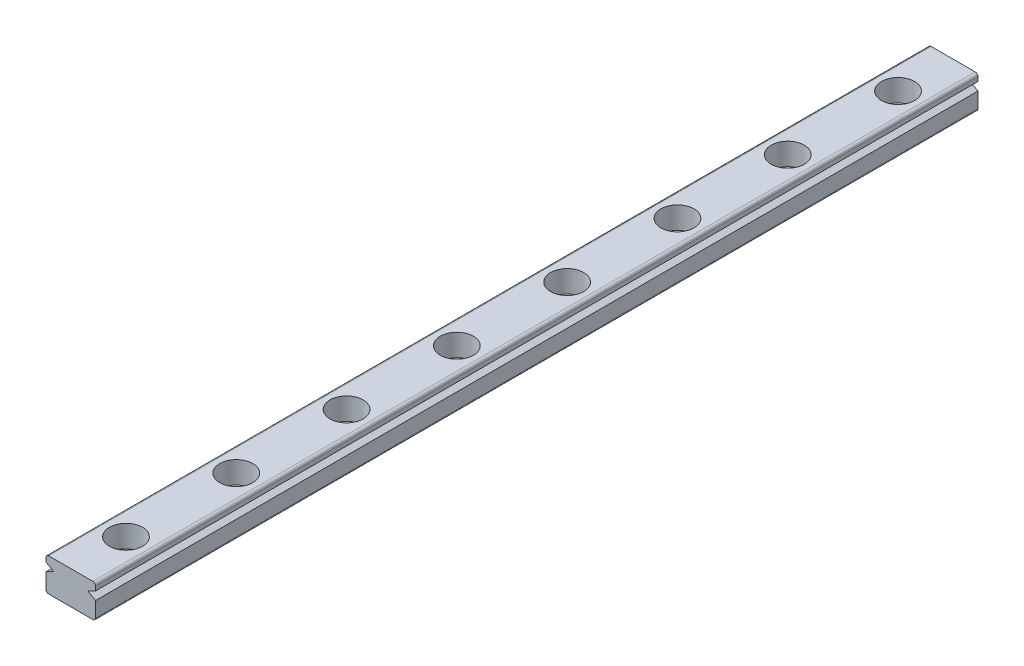
ISO-10303-21;
HEADER;
FILE_DESCRIPTION(('STEP AP214'),'2;1');
FILE_NAME('part.step','',(''),(''),'','','');
FILE_SCHEMA(('AUTOMOTIVE_DESIGN { 1 0 10303 214 1 1 1 1 }'));
ENDSEC;
DATA;
#1=APPLICATION_CONTEXT('core data for automotive mechanical design processes');
#2=APPLICATION_PROTOCOL_DEFINITION('international standard','automotive_design',2000,#1);
#3=PRODUCT_CONTEXT('',#1,'mechanical');
#4=PRODUCT('Part','Part','',(#3));
#5=PRODUCT_RELATED_PRODUCT_CATEGORY('part','',(#4));
#6=PRODUCT_DEFINITION_FORMATION('','',#4);
#7=PRODUCT_DEFINITION_CONTEXT('part definition',#1,'design');
#8=PRODUCT_DEFINITION('design','',#6,#7);
#9=PRODUCT_DEFINITION_SHAPE('','',#8);
#10=(LENGTH_UNIT() NAMED_UNIT(*) SI_UNIT(.MILLI.,.METRE.));
#11=(NAMED_UNIT(*) PLANE_ANGLE_UNIT() SI_UNIT($,.RADIAN.));
#12=(NAMED_UNIT(*) SI_UNIT($,.STERADIAN.) SOLID_ANGLE_UNIT());
#13=UNCERTAINTY_MEASURE_WITH_UNIT(LENGTH_MEASURE(1.E-05),#10,'distance_accuracy_value','');
#14=(GEOMETRIC_REPRESENTATION_CONTEXT(3) GLOBAL_UNCERTAINTY_ASSIGNED_CONTEXT((#13)) GLOBAL_UNIT_ASSIGNED_CONTEXT((#10,
#11,#12)) REPRESENTATION_CONTEXT('',''));
#15=CARTESIAN_POINT('',(0.,0.,0.));
#16=DIRECTION('',(0.,0.,1.));
#17=DIRECTION('',(1.,0.,0.));
#18=AXIS2_PLACEMENT_3D('',#15,#16,#17);
#19=CARTESIAN_POINT('',(0.,0.,150.));
#20=DIRECTION('',(0.,1.,0.));
#21=DIRECTION('',(-1.,0.,0.));
#22=AXIS2_PLACEMENT_3D('',#19,#20,#21);
#23=CYLINDRICAL_SURFACE('',#22,1.75);
#24=CARTESIAN_POINT('',(0.,0.,150.));
#25=DIRECTION('',(0.,1.,0.));
#26=DIRECTION('',(-1.,0.,0.));
#27=AXIS2_PLACEMENT_3D('',#24,#25,#26);
#28=CIRCLE('',#27,1.75);
#29=CARTESIAN_POINT('',(-1.75,0.,150.));
#30=VERTEX_POINT('',#29);
#31=EDGE_CURVE('E304',#30,#30,#28,.T.);
#32=ORIENTED_EDGE('',*,*,#31,.F.);
#33=EDGE_LOOP('',(#32));
#34=FACE_BOUND('',#33,.T.);
#35=CARTESIAN_POINT('',(0.,2.,150.));
#36=DIRECTION('',(0.,1.,0.));
#37=DIRECTION('',(-1.,0.,0.));
#38=AXIS2_PLACEMENT_3D('',#35,#36,#37);
#39=CIRCLE('',#38,1.75);
#40=CARTESIAN_POINT('',(-1.75,2.,150.));
#41=VERTEX_POINT('',#40);
#42=EDGE_CURVE('E11',#41,#41,#39,.T.);
#43=ORIENTED_EDGE('',*,*,#42,.T.);
#44=EDGE_LOOP('',(#43));
#45=FACE_BOUND('',#44,.T.);
#46=ADVANCED_FACE('F33',(#34,#45),#23,.F.);
#47=CARTESIAN_POINT('',(0.,2.,150.));
#48=DIRECTION('',(0.,1.,0.));
#49=DIRECTION('',(-1.,0.,0.));
#50=AXIS2_PLACEMENT_3D('',#47,#48,#49);
#51=PLANE('',#50);
#52=ORIENTED_EDGE('',*,*,#42,.F.);
#53=EDGE_LOOP('',(#52));
#54=FACE_BOUND('',#53,.T.);
#55=CARTESIAN_POINT('',(0.,2.,150.));
#56=DIRECTION('',(0.,1.,0.));
#57=DIRECTION('',(-1.,0.,0.));
#58=AXIS2_PLACEMENT_3D('',#55,#56,#57);
#59=CIRCLE('',#58,3.);
#60=CARTESIAN_POINT('',(-3.,2.,150.));
#61=VERTEX_POINT('',#60);
#62=EDGE_CURVE('E40',#61,#61,#59,.T.);
#63=ORIENTED_EDGE('',*,*,#62,.T.);
#64=EDGE_LOOP('',(#63));
#65=FACE_BOUND('',#64,.T.);
#66=ADVANCED_FACE('F312',(#54,#65),#51,.T.);
#67=CARTESIAN_POINT('',(0.,2.,150.));
#68=DIRECTION('',(0.,1.,0.));
#69=DIRECTION('',(-1.,0.,0.));
#70=AXIS2_PLACEMENT_3D('',#67,#68,#69);
#71=CYLINDRICAL_SURFACE('',#70,3.);
#72=ORIENTED_EDGE('',*,*,#62,.F.);
#73=EDGE_LOOP('',(#72));
#74=FACE_BOUND('',#73,.T.);
#75=CARTESIAN_POINT('',(0.,6.,150.));
#76=DIRECTION('',(0.,1.,0.));
#77=DIRECTION('',(-1.,0.,0.));
#78=AXIS2_PLACEMENT_3D('',#75,#76,#77);
#79=CIRCLE('',#78,3.);
#80=CARTESIAN_POINT('',(-3.,6.,150.));
#81=VERTEX_POINT('',#80);
#82=EDGE_CURVE('E307',#81,#81,#79,.T.);
#83=ORIENTED_EDGE('',*,*,#82,.T.);
#84=EDGE_LOOP('',(#83));
#85=FACE_BOUND('',#84,.T.);
#86=ADVANCED_FACE('F314',(#74,#85),#71,.F.);
#87=CARTESIAN_POINT('',(0.,0.,130.));
#88=DIRECTION('',(0.,1.,0.));
#89=DIRECTION('',(-1.,0.,0.));
#90=AXIS2_PLACEMENT_3D('',#87,#88,#89);
#91=CYLINDRICAL_SURFACE('',#90,1.75);
#92=CARTESIAN_POINT('',(0.,0.,130.));
#93=DIRECTION('',(0.,1.,0.));
#94=DIRECTION('',(-1.,0.,0.));
#95=AXIS2_PLACEMENT_3D('',#92,#93,#94);
#96=CIRCLE('',#95,1.75);
#97=CARTESIAN_POINT('',(-1.75,0.,130.));
#98=VERTEX_POINT('',#97);
#99=EDGE_CURVE('E292',#98,#98,#96,.T.);
#100=ORIENTED_EDGE('',*,*,#99,.F.);
#101=EDGE_LOOP('',(#100));
#102=FACE_BOUND('',#101,.T.);
#103=CARTESIAN_POINT('',(0.,2.,130.));
#104=DIRECTION('',(0.,1.,0.));
#105=DIRECTION('',(-1.,0.,0.));
#106=AXIS2_PLACEMENT_3D('',#103,#104,#105);
#107=CIRCLE('',#106,1.75);
#108=CARTESIAN_POINT('',(-1.75,2.,130.));
#109=VERTEX_POINT('',#108);
#110=EDGE_CURVE('E301',#109,#109,#107,.T.);
#111=ORIENTED_EDGE('',*,*,#110,.T.);
#112=EDGE_LOOP('',(#111));
#113=FACE_BOUND('',#112,.T.);
#114=ADVANCED_FACE('F317',(#102,#113),#91,.F.);
#115=CARTESIAN_POINT('',(0.,2.,130.));
#116=DIRECTION('',(0.,1.,0.));
#117=DIRECTION('',(-1.,0.,0.));
#118=AXIS2_PLACEMENT_3D('',#115,#116,#117);
#119=PLANE('',#118);
#120=ORIENTED_EDGE('',*,*,#110,.F.);
#121=EDGE_LOOP('',(#120));
#122=FACE_BOUND('',#121,.T.);
#123=CARTESIAN_POINT('',(0.,2.,130.));
#124=DIRECTION('',(0.,1.,0.));
#125=DIRECTION('',(-1.,0.,0.));
#126=AXIS2_PLACEMENT_3D('',#123,#124,#125);
#127=CIRCLE('',#126,3.);
#128=CARTESIAN_POINT('',(-3.,2.,130.));
#129=VERTEX_POINT('',#128);
#130=EDGE_CURVE('E298',#129,#129,#127,.T.);
#131=ORIENTED_EDGE('',*,*,#130,.T.);
#132=EDGE_LOOP('',(#131));
#133=FACE_BOUND('',#132,.T.);
#134=ADVANCED_FACE('F434',(#122,#133),#119,.T.);
#135=CARTESIAN_POINT('',(0.,2.,130.));
#136=DIRECTION('',(0.,1.,0.));
#137=DIRECTION('',(-1.,0.,0.));
#138=AXIS2_PLACEMENT_3D('',#135,#136,#137);
#139=CYLINDRICAL_SURFACE('',#138,3.);
#140=ORIENTED_EDGE('',*,*,#130,.F.);
#141=EDGE_LOOP('',(#140));
#142=FACE_BOUND('',#141,.T.);
#143=CARTESIAN_POINT('',(0.,6.,130.));
#144=DIRECTION('',(0.,1.,0.));
#145=DIRECTION('',(-1.,0.,0.));
#146=AXIS2_PLACEMENT_3D('',#143,#144,#145);
#147=CIRCLE('',#146,3.);
#148=CARTESIAN_POINT('',(-3.,6.,130.));
#149=VERTEX_POINT('',#148);
#150=EDGE_CURVE('E295',#149,#149,#147,.T.);
#151=ORIENTED_EDGE('',*,*,#150,.T.);
#152=EDGE_LOOP('',(#151));
#153=FACE_BOUND('',#152,.T.);
#154=ADVANCED_FACE('F430',(#142,#153),#139,.F.);
#155=CARTESIAN_POINT('',(0.,0.,110.));
#156=DIRECTION('',(0.,1.,0.));
#157=DIRECTION('',(-1.,0.,0.));
#158=AXIS2_PLACEMENT_3D('',#155,#156,#157);
#159=CYLINDRICAL_SURFACE('',#158,1.75);
#160=CARTESIAN_POINT('',(0.,0.,110.));
#161=DIRECTION('',(0.,1.,0.));
#162=DIRECTION('',(-1.,0.,0.));
#163=AXIS2_PLACEMENT_3D('',#160,#161,#162);
#164=CIRCLE('',#163,1.75);
#165=CARTESIAN_POINT('',(-1.75,0.,110.));
#166=VERTEX_POINT('',#165);
#167=EDGE_CURVE('E280',#166,#166,#164,.T.);
#168=ORIENTED_EDGE('',*,*,#167,.F.);
#169=EDGE_LOOP('',(#168));
#170=FACE_BOUND('',#169,.T.);
#171=CARTESIAN_POINT('',(0.,2.,110.));
#172=DIRECTION('',(0.,1.,0.));
#173=DIRECTION('',(-1.,0.,0.));
#174=AXIS2_PLACEMENT_3D('',#171,#172,#173);
#175=CIRCLE('',#174,1.75);
#176=CARTESIAN_POINT('',(-1.75,2.,110.));
#177=VERTEX_POINT('',#176);
#178=EDGE_CURVE('E289',#177,#177,#175,.T.);
#179=ORIENTED_EDGE('',*,*,#178,.T.);
#180=EDGE_LOOP('',(#179));
#181=FACE_BOUND('',#180,.T.);
#182=ADVANCED_FACE('F426',(#170,#181),#159,.F.);
#183=CARTESIAN_POINT('',(0.,2.,110.));
#184=DIRECTION('',(0.,1.,0.));
#185=DIRECTION('',(-1.,0.,0.));
#186=AXIS2_PLACEMENT_3D('',#183,#184,#185);
#187=PLANE('',#186);
#188=ORIENTED_EDGE('',*,*,#178,.F.);
#189=EDGE_LOOP('',(#188));
#190=FACE_BOUND('',#189,.T.);
#191=CARTESIAN_POINT('',(0.,2.,110.));
#192=DIRECTION('',(0.,1.,0.));
#193=DIRECTION('',(-1.,0.,0.));
#194=AXIS2_PLACEMENT_3D('',#191,#192,#193);
#195=CIRCLE('',#194,3.);
#196=CARTESIAN_POINT('',(-3.,2.,110.));
#197=VERTEX_POINT('',#196);
#198=EDGE_CURVE('E286',#197,#197,#195,.T.);
#199=ORIENTED_EDGE('',*,*,#198,.T.);
#200=EDGE_LOOP('',(#199));
#201=FACE_BOUND('',#200,.T.);
#202=ADVANCED_FACE('F422',(#190,#201),#187,.T.);
#203=CARTESIAN_POINT('',(0.,2.,110.));
#204=DIRECTION('',(0.,1.,0.));
#205=DIRECTION('',(-1.,0.,0.));
#206=AXIS2_PLACEMENT_3D('',#203,#204,#205);
#207=CYLINDRICAL_SURFACE('',#206,3.);
#208=ORIENTED_EDGE('',*,*,#198,.F.);
#209=EDGE_LOOP('',(#208));
#210=FACE_BOUND('',#209,.T.);
#211=CARTESIAN_POINT('',(0.,6.,110.));
#212=DIRECTION('',(0.,1.,0.));
#213=DIRECTION('',(-1.,0.,0.));
#214=AXIS2_PLACEMENT_3D('',#211,#212,#213);
#215=CIRCLE('',#214,3.);
#216=CARTESIAN_POINT('',(-3.,6.,110.));
#217=VERTEX_POINT('',#216);
#218=EDGE_CURVE('E283',#217,#217,#215,.T.);
#219=ORIENTED_EDGE('',*,*,#218,.T.);
#220=EDGE_LOOP('',(#219));
#221=FACE_BOUND('',#220,.T.);
#222=ADVANCED_FACE('F418',(#210,#221),#207,.F.);
#223=CARTESIAN_POINT('',(0.,0.,90.));
#224=DIRECTION('',(0.,1.,0.));
#225=DIRECTION('',(-1.,0.,0.));
#226=AXIS2_PLACEMENT_3D('',#223,#224,#225);
#227=CYLINDRICAL_SURFACE('',#226,1.75);
#228=CARTESIAN_POINT('',(0.,0.,90.));
#229=DIRECTION('',(0.,1.,0.));
#230=DIRECTION('',(-1.,0.,0.));
#231=AXIS2_PLACEMENT_3D('',#228,#229,#230);
#232=CIRCLE('',#231,1.75);
#233=CARTESIAN_POINT('',(-1.75,0.,90.));
#234=VERTEX_POINT('',#233);
#235=EDGE_CURVE('E268',#234,#234,#232,.T.);
#236=ORIENTED_EDGE('',*,*,#235,.F.);
#237=EDGE_LOOP('',(#236));
#238=FACE_BOUND('',#237,.T.);
#239=CARTESIAN_POINT('',(0.,2.,90.));
#240=DIRECTION('',(0.,1.,0.));
#241=DIRECTION('',(-1.,0.,0.));
#242=AXIS2_PLACEMENT_3D('',#239,#240,#241);
#243=CIRCLE('',#242,1.75);
#244=CARTESIAN_POINT('',(-1.75,2.,90.));
#245=VERTEX_POINT('',#244);
#246=EDGE_CURVE('E277',#245,#245,#243,.T.);
#247=ORIENTED_EDGE('',*,*,#246,.T.);
#248=EDGE_LOOP('',(#247));
#249=FACE_BOUND('',#248,.T.);
#250=ADVANCED_FACE('F414',(#238,#249),#227,.F.);
#251=CARTESIAN_POINT('',(0.,2.,90.));
#252=DIRECTION('',(0.,1.,0.));
#253=DIRECTION('',(-1.,0.,0.));
#254=AXIS2_PLACEMENT_3D('',#251,#252,#253);
#255=PLANE('',#254);
#256=ORIENTED_EDGE('',*,*,#246,.F.);
#257=EDGE_LOOP('',(#256));
#258=FACE_BOUND('',#257,.T.);
#259=CARTESIAN_POINT('',(0.,2.,90.));
#260=DIRECTION('',(0.,1.,0.));
#261=DIRECTION('',(-1.,0.,0.));
#262=AXIS2_PLACEMENT_3D('',#259,#260,#261);
#263=CIRCLE('',#262,3.);
#264=CARTESIAN_POINT('',(-3.,2.,90.));
#265=VERTEX_POINT('',#264);
#266=EDGE_CURVE('E274',#265,#265,#263,.T.);
#267=ORIENTED_EDGE('',*,*,#266,.T.);
#268=EDGE_LOOP('',(#267));
#269=FACE_BOUND('',#268,.T.);
#270=ADVANCED_FACE('F410',(#258,#269),#255,.T.);
#271=CARTESIAN_POINT('',(0.,2.,90.));
#272=DIRECTION('',(0.,1.,0.));
#273=DIRECTION('',(-1.,0.,0.));
#274=AXIS2_PLACEMENT_3D('',#271,#272,#273);
#275=CYLINDRICAL_SURFACE('',#274,3.);
#276=ORIENTED_EDGE('',*,*,#266,.F.);
#277=EDGE_LOOP('',(#276));
#278=FACE_BOUND('',#277,.T.);
#279=CARTESIAN_POINT('',(0.,6.,90.));
#280=DIRECTION('',(0.,1.,0.));
#281=DIRECTION('',(-1.,0.,0.));
#282=AXIS2_PLACEMENT_3D('',#279,#280,#281);
#283=CIRCLE('',#282,3.);
#284=CARTESIAN_POINT('',(-3.,6.,90.));
#285=VERTEX_POINT('',#284);
#286=EDGE_CURVE('E271',#285,#285,#283,.T.);
#287=ORIENTED_EDGE('',*,*,#286,.T.);
#288=EDGE_LOOP('',(#287));
#289=FACE_BOUND('',#288,.T.);
#290=ADVANCED_FACE('F406',(#278,#289),#275,.F.);
#291=CARTESIAN_POINT('',(0.,0.,70.));
#292=DIRECTION('',(0.,1.,0.));
#293=DIRECTION('',(-1.,0.,0.));
#294=AXIS2_PLACEMENT_3D('',#291,#292,#293);
#295=CYLINDRICAL_SURFACE('',#294,1.75);
#296=CARTESIAN_POINT('',(0.,0.,70.));
#297=DIRECTION('',(0.,1.,0.));
#298=DIRECTION('',(-1.,0.,0.));
#299=AXIS2_PLACEMENT_3D('',#296,#297,#298);
#300=CIRCLE('',#299,1.75);
#301=CARTESIAN_POINT('',(-1.75,0.,70.));
#302=VERTEX_POINT('',#301);
#303=EDGE_CURVE('E256',#302,#302,#300,.T.);
#304=ORIENTED_EDGE('',*,*,#303,.F.);
#305=EDGE_LOOP('',(#304));
#306=FACE_BOUND('',#305,.T.);
#307=CARTESIAN_POINT('',(0.,2.,70.));
#308=DIRECTION('',(0.,1.,0.));
#309=DIRECTION('',(-1.,0.,0.));
#310=AXIS2_PLACEMENT_3D('',#307,#308,#309);
#311=CIRCLE('',#310,1.75);
#312=CARTESIAN_POINT('',(-1.75,2.,70.));
#313=VERTEX_POINT('',#312);
#314=EDGE_CURVE('E265',#313,#313,#311,.T.);
#315=ORIENTED_EDGE('',*,*,#314,.T.);
#316=EDGE_LOOP('',(#315));
#317=FACE_BOUND('',#316,.T.);
#318=ADVANCED_FACE('F402',(#306,#317),#295,.F.);
#319=CARTESIAN_POINT('',(0.,2.,70.));
#320=DIRECTION('',(0.,1.,0.));
#321=DIRECTION('',(-1.,0.,0.));
#322=AXIS2_PLACEMENT_3D('',#319,#320,#321);
#323=PLANE('',#322);
#324=ORIENTED_EDGE('',*,*,#314,.F.);
#325=EDGE_LOOP('',(#324));
#326=FACE_BOUND('',#325,.T.);
#327=CARTESIAN_POINT('',(0.,2.,70.));
#328=DIRECTION('',(0.,1.,0.));
#329=DIRECTION('',(-1.,0.,0.));
#330=AXIS2_PLACEMENT_3D('',#327,#328,#329);
#331=CIRCLE('',#330,3.);
#332=CARTESIAN_POINT('',(-3.,2.,70.));
#333=VERTEX_POINT('',#332);
#334=EDGE_CURVE('E262',#333,#333,#331,.T.);
#335=ORIENTED_EDGE('',*,*,#334,.T.);
#336=EDGE_LOOP('',(#335));
#337=FACE_BOUND('',#336,.T.);
#338=ADVANCED_FACE('F398',(#326,#337),#323,.T.);
#339=CARTESIAN_POINT('',(0.,2.,70.));
#340=DIRECTION('',(0.,1.,0.));
#341=DIRECTION('',(-1.,0.,0.));
#342=AXIS2_PLACEMENT_3D('',#339,#340,#341);
#343=CYLINDRICAL_SURFACE('',#342,3.);
#344=ORIENTED_EDGE('',*,*,#334,.F.);
#345=EDGE_LOOP('',(#344));
#346=FACE_BOUND('',#345,.T.);
#347=CARTESIAN_POINT('',(0.,6.,70.));
#348=DIRECTION('',(0.,1.,0.));
#349=DIRECTION('',(-1.,0.,0.));
#350=AXIS2_PLACEMENT_3D('',#347,#348,#349);
#351=CIRCLE('',#350,3.);
#352=CARTESIAN_POINT('',(-3.,6.,70.));
#353=VERTEX_POINT('',#352);
#354=EDGE_CURVE('E259',#353,#353,#351,.T.);
#355=ORIENTED_EDGE('',*,*,#354,.T.);
#356=EDGE_LOOP('',(#355));
#357=FACE_BOUND('',#356,.T.);
#358=ADVANCED_FACE('F394',(#346,#357),#343,.F.);
#359=CARTESIAN_POINT('',(0.,0.,50.));
#360=DIRECTION('',(0.,1.,0.));
#361=DIRECTION('',(-1.,0.,0.));
#362=AXIS2_PLACEMENT_3D('',#359,#360,#361);
#363=CYLINDRICAL_SURFACE('',#362,1.75);
#364=CARTESIAN_POINT('',(0.,0.,50.));
#365=DIRECTION('',(0.,1.,0.));
#366=DIRECTION('',(-1.,0.,0.));
#367=AXIS2_PLACEMENT_3D('',#364,#365,#366);
#368=CIRCLE('',#367,1.75);
#369=CARTESIAN_POINT('',(-1.75,0.,50.));
#370=VERTEX_POINT('',#369);
#371=EDGE_CURVE('E244',#370,#370,#368,.T.);
#372=ORIENTED_EDGE('',*,*,#371,.F.);
#373=EDGE_LOOP('',(#372));
#374=FACE_BOUND('',#373,.T.);
#375=CARTESIAN_POINT('',(0.,2.,50.));
#376=DIRECTION('',(0.,1.,0.));
#377=DIRECTION('',(-1.,0.,0.));
#378=AXIS2_PLACEMENT_3D('',#375,#376,#377);
#379=CIRCLE('',#378,1.75);
#380=CARTESIAN_POINT('',(-1.75,2.,50.));
#381=VERTEX_POINT('',#380);
#382=EDGE_CURVE('E253',#381,#381,#379,.T.);
#383=ORIENTED_EDGE('',*,*,#382,.T.);
#384=EDGE_LOOP('',(#383));
#385=FACE_BOUND('',#384,.T.);
#386=ADVANCED_FACE('F390',(#374,#385),#363,.F.);
#387=CARTESIAN_POINT('',(0.,2.,50.));
#388=DIRECTION('',(0.,1.,0.));
#389=DIRECTION('',(-1.,0.,0.));
#390=AXIS2_PLACEMENT_3D('',#387,#388,#389);
#391=PLANE('',#390);
#392=ORIENTED_EDGE('',*,*,#382,.F.);
#393=EDGE_LOOP('',(#392));
#394=FACE_BOUND('',#393,.T.);
#395=CARTESIAN_POINT('',(0.,2.,50.));
#396=DIRECTION('',(0.,1.,0.));
#397=DIRECTION('',(-1.,0.,0.));
#398=AXIS2_PLACEMENT_3D('',#395,#396,#397);
#399=CIRCLE('',#398,3.);
#400=CARTESIAN_POINT('',(-3.,2.,50.));
#401=VERTEX_POINT('',#400);
#402=EDGE_CURVE('E250',#401,#401,#399,.T.);
#403=ORIENTED_EDGE('',*,*,#402,.T.);
#404=EDGE_LOOP('',(#403));
#405=FACE_BOUND('',#404,.T.);
#406=ADVANCED_FACE('F386',(#394,#405),#391,.T.);
#407=CARTESIAN_POINT('',(0.,2.,50.));
#408=DIRECTION('',(0.,1.,0.));
#409=DIRECTION('',(-1.,0.,0.));
#410=AXIS2_PLACEMENT_3D('',#407,#408,#409);
#411=CYLINDRICAL_SURFACE('',#410,3.);
#412=ORIENTED_EDGE('',*,*,#402,.F.);
#413=EDGE_LOOP('',(#412));
#414=FACE_BOUND('',#413,.T.);
#415=CARTESIAN_POINT('',(0.,6.,50.));
#416=DIRECTION('',(0.,1.,0.));
#417=DIRECTION('',(-1.,0.,0.));
#418=AXIS2_PLACEMENT_3D('',#415,#416,#417);
#419=CIRCLE('',#418,3.);
#420=CARTESIAN_POINT('',(-3.,6.,50.));
#421=VERTEX_POINT('',#420);
#422=EDGE_CURVE('E247',#421,#421,#419,.T.);
#423=ORIENTED_EDGE('',*,*,#422,.T.);
#424=EDGE_LOOP('',(#423));
#425=FACE_BOUND('',#424,.T.);
#426=ADVANCED_FACE('F359',(#414,#425),#411,.F.);
#427=CARTESIAN_POINT('',(-4.5,3.25,160.));
#428=DIRECTION('',(1.,0.,0.));
#429=DIRECTION('',(0.,0.,-1.));
#430=AXIS2_PLACEMENT_3D('',#427,#428,#429);
#431=PLANE('',#430);
#432=DIRECTION('',(0.,-1.,0.));
#433=VECTOR('',#432,1.);
#434=CARTESIAN_POINT('',(-4.5,3.25,0.));
#435=LINE('',#434,#433);
#436=CARTESIAN_POINT('',(-4.5,3.25,0.));
#437=VERTEX_POINT('',#436);
#438=CARTESIAN_POINT('',(-4.5,0.5,0.));
#439=VERTEX_POINT('',#438);
#440=EDGE_CURVE('E177',#437,#439,#435,.T.);
#441=ORIENTED_EDGE('',*,*,#440,.T.);
#442=DIRECTION('',(0.,0.,-1.));
#443=VECTOR('',#442,1.);
#444=CARTESIAN_POINT('',(-4.5,0.5,160.));
#445=LINE('',#444,#443);
#446=CARTESIAN_POINT('',(-4.5,0.5,160.));
#447=VERTEX_POINT('',#446);
#448=EDGE_CURVE('E233',#439,#447,#445,.F.);
#449=ORIENTED_EDGE('',*,*,#448,.T.);
#450=DIRECTION('',(0.,-1.,0.));
#451=VECTOR('',#450,1.);
#452=CARTESIAN_POINT('',(-4.5,3.25,160.));
#453=LINE('',#452,#451);
#454=CARTESIAN_POINT('',(-4.5,3.25,160.));
#455=VERTEX_POINT('',#454);
#456=EDGE_CURVE('E200',#455,#447,#453,.T.);
#457=ORIENTED_EDGE('',*,*,#456,.F.);
#458=DIRECTION('',(0.,0.,-1.));
#459=VECTOR('',#458,1.);
#460=CARTESIAN_POINT('',(-4.5,3.25,160.));
#461=LINE('',#460,#459);
#462=EDGE_CURVE('E176',#455,#437,#461,.T.);
#463=ORIENTED_EDGE('',*,*,#462,.T.);
#464=EDGE_LOOP('',(#441,#449,#457,#463));
#465=FACE_BOUND('',#464,.T.);
#466=ADVANCED_FACE('F351',(#465),#431,.F.);
#467=CARTESIAN_POINT('',(-4.5,0.,160.));
#468=DIRECTION('',(0.,1.,0.));
#469=DIRECTION('',(-1.,0.,0.));
#470=AXIS2_PLACEMENT_3D('',#467,#468,#469);
#471=PLANE('',#470);
#472=CARTESIAN_POINT('',(0.,0.,30.));
#473=DIRECTION('',(0.,1.,0.));
#474=DIRECTION('',(-1.,0.,0.));
#475=AXIS2_PLACEMENT_3D('',#472,#473,#474);
#476=CIRCLE('',#475,1.75);
#477=CARTESIAN_POINT('',(-1.75,0.,30.));
#478=VERTEX_POINT('',#477);
#479=EDGE_CURVE('E742',#478,#478,#476,.T.);
#480=ORIENTED_EDGE('',*,*,#479,.T.);
#481=EDGE_LOOP('',(#480));
#482=FACE_BOUND('',#481,.T.);
#483=CARTESIAN_POINT('',(0.,0.,10.));
#484=DIRECTION('',(0.,1.,0.));
#485=DIRECTION('',(-1.,0.,0.));
#486=AXIS2_PLACEMENT_3D('',#483,#484,#485);
#487=CIRCLE('',#486,1.75);
#488=CARTESIAN_POINT('',(-1.75,0.,10.));
#489=VERTEX_POINT('',#488);
#490=EDGE_CURVE('E725',#489,#489,#487,.T.);
#491=ORIENTED_EDGE('',*,*,#490,.T.);
#492=EDGE_LOOP('',(#491));
#493=FACE_BOUND('',#492,.T.);
#494=DIRECTION('',(1.,0.,0.));
#495=VECTOR('',#494,1.);
#496=CARTESIAN_POINT('',(-4.5,0.,0.));
#497=LINE('',#496,#495);
#498=CARTESIAN_POINT('',(-4.,0.,0.));
#499=VERTEX_POINT('',#498);
#500=CARTESIAN_POINT('',(4.,0.,0.));
#501=VERTEX_POINT('',#500);
#502=EDGE_CURVE('E180',#499,#501,#497,.T.);
#503=ORIENTED_EDGE('',*,*,#502,.T.);
#504=DIRECTION('',(0.,0.,-1.));
#505=VECTOR('',#504,1.);
#506=CARTESIAN_POINT('',(4.,0.,160.));
#507=LINE('',#506,#505);
#508=CARTESIAN_POINT('',(4.,0.,160.));
#509=VERTEX_POINT('',#508);
#510=EDGE_CURVE('E225',#501,#509,#507,.F.);
#511=ORIENTED_EDGE('',*,*,#510,.T.);
#512=DIRECTION('',(1.,0.,0.));
#513=VECTOR('',#512,1.);
#514=CARTESIAN_POINT('',(-4.5,0.,160.));
#515=LINE('',#514,#513);
#516=CARTESIAN_POINT('',(-4.,0.,160.));
#517=VERTEX_POINT('',#516);
#518=EDGE_CURVE('E145',#517,#509,#515,.T.);
#519=ORIENTED_EDGE('',*,*,#518,.F.);
#520=DIRECTION('',(0.,0.,-1.));
#521=VECTOR('',#520,1.);
#522=CARTESIAN_POINT('',(-4.,0.,160.));
#523=LINE('',#522,#521);
#524=EDGE_CURVE('E222',#517,#499,#523,.T.);
#525=ORIENTED_EDGE('',*,*,#524,.T.);
#526=EDGE_LOOP('',(#503,#511,#519,#525));
#527=FACE_BOUND('',#526,.T.);
#528=ORIENTED_EDGE('',*,*,#371,.T.);
#529=EDGE_LOOP('',(#528));
#530=FACE_BOUND('',#529,.T.);
#531=ORIENTED_EDGE('',*,*,#303,.T.);
#532=EDGE_LOOP('',(#531));
#533=FACE_BOUND('',#532,.T.);
#534=ORIENTED_EDGE('',*,*,#235,.T.);
#535=EDGE_LOOP('',(#534));
#536=FACE_BOUND('',#535,.T.);
#537=ORIENTED_EDGE('',*,*,#167,.T.);
#538=EDGE_LOOP('',(#537));
#539=FACE_BOUND('',#538,.T.);
#540=ORIENTED_EDGE('',*,*,#99,.T.);
#541=EDGE_LOOP('',(#540));
#542=FACE_BOUND('',#541,.T.);
#543=ORIENTED_EDGE('',*,*,#31,.T.);
#544=EDGE_LOOP('',(#543));
#545=FACE_BOUND('',#544,.T.);
#546=ADVANCED_FACE('F349',(#482,#493,#527,#530,#533,#536,#539,#542,#545),#471,.F.);
#547=CARTESIAN_POINT('',(4.5,0.,160.));
#548=DIRECTION('',(-1.,0.,0.));
#549=DIRECTION('',(0.,-1.,0.));
#550=AXIS2_PLACEMENT_3D('',#547,#548,#549);
#551=PLANE('',#550);
#552=DIRECTION('',(0.,1.,0.));
#553=VECTOR('',#552,1.);
#554=CARTESIAN_POINT('',(4.5,0.,160.));
#555=LINE('',#554,#553);
#556=CARTESIAN_POINT('',(4.5,0.500000000000002,160.));
#557=VERTEX_POINT('',#556);
#558=CARTESIAN_POINT('',(4.5,3.25,160.));
#559=VERTEX_POINT('',#558);
#560=EDGE_CURVE('E133',#557,#559,#555,.T.);
#561=ORIENTED_EDGE('',*,*,#560,.F.);
#562=DIRECTION('',(0.,0.,-1.));
#563=VECTOR('',#562,1.);
#564=CARTESIAN_POINT('',(4.5,0.500000000000002,160.));
#565=LINE('',#564,#563);
#566=CARTESIAN_POINT('',(4.5,0.500000000000002,0.));
#567=VERTEX_POINT('',#566);
#568=EDGE_CURVE('E154',#557,#567,#565,.T.);
#569=ORIENTED_EDGE('',*,*,#568,.T.);
#570=DIRECTION('',(0.,1.,0.));
#571=VECTOR('',#570,1.);
#572=CARTESIAN_POINT('',(4.5,0.,0.));
#573=LINE('',#572,#571);
#574=CARTESIAN_POINT('',(4.5,3.25,0.));
#575=VERTEX_POINT('',#574);
#576=EDGE_CURVE('E151',#567,#575,#573,.T.);
#577=ORIENTED_EDGE('',*,*,#576,.T.);
#578=DIRECTION('',(0.,0.,-1.));
#579=VECTOR('',#578,1.);
#580=CARTESIAN_POINT('',(4.5,3.25,160.));
#581=LINE('',#580,#579);
#582=EDGE_CURVE('E148',#559,#575,#581,.T.);
#583=ORIENTED_EDGE('',*,*,#582,.F.);
#584=EDGE_LOOP('',(#561,#569,#577,#583));
#585=FACE_BOUND('',#584,.T.);
#586=ADVANCED_FACE('F149',(#585),#551,.F.);
#587=CARTESIAN_POINT('',(4.5,3.25,160.));
#588=DIRECTION('',(-0.472221412515418,-0.881479970028782,0.));
#589=DIRECTION('',(0.881479970028782,-0.472221412515418,0.));
#590=AXIS2_PLACEMENT_3D('',#587,#588,#589);
#591=PLANE('',#590);
#592=DIRECTION('',(-0.881479970028782,0.472221412515418,0.));
#593=VECTOR('',#592,1.);
#594=CARTESIAN_POINT('',(4.5,3.25,0.));
#595=LINE('',#594,#593);
#596=CARTESIAN_POINT('',(3.1,4.,0.));
#597=VERTEX_POINT('',#596);
#598=EDGE_CURVE('E185',#575,#597,#595,.T.);
#599=ORIENTED_EDGE('',*,*,#598,.T.);
#600=DIRECTION('',(0.,0.,-1.));
#601=VECTOR('',#600,1.);
#602=CARTESIAN_POINT('',(3.1,4.,160.));
#603=LINE('',#602,#601);
#604=CARTESIAN_POINT('',(3.1,4.,160.));
#605=VERTEX_POINT('',#604);
#606=EDGE_CURVE('E155',#605,#597,#603,.T.);
#607=ORIENTED_EDGE('',*,*,#606,.F.);
#608=DIRECTION('',(-0.881479970028782,0.472221412515418,0.));
#609=VECTOR('',#608,1.);
#610=CARTESIAN_POINT('',(4.5,3.25,160.));
#611=LINE('',#610,#609);
#612=EDGE_CURVE('E138',#559,#605,#611,.T.);
#613=ORIENTED_EDGE('',*,*,#612,.F.);
#614=ORIENTED_EDGE('',*,*,#582,.T.);
#615=EDGE_LOOP('',(#599,#607,#613,#614));
#616=FACE_BOUND('',#615,.T.);
#617=ADVANCED_FACE('F157',(#616),#591,.F.);
#618=CARTESIAN_POINT('',(3.1,4.,160.));
#619=DIRECTION('',(-0.472221412515419,0.881479970028782,0.));
#620=DIRECTION('',(-0.881479970028782,-0.472221412515419,0.));
#621=AXIS2_PLACEMENT_3D('',#618,#619,#620);
#622=PLANE('',#621);
#623=DIRECTION('',(0.881479970028782,0.472221412515419,0.));
#624=VECTOR('',#623,1.);
#625=CARTESIAN_POINT('',(3.1,4.,0.));
#626=LINE('',#625,#624);
#627=CARTESIAN_POINT('',(4.5,4.75,0.));
#628=VERTEX_POINT('',#627);
#629=EDGE_CURVE('E187',#597,#628,#626,.T.);
#630=ORIENTED_EDGE('',*,*,#629,.T.);
#631=DIRECTION('',(0.,0.,-1.));
#632=VECTOR('',#631,1.);
#633=CARTESIAN_POINT('',(4.5,4.75,160.));
#634=LINE('',#633,#632);
#635=CARTESIAN_POINT('',(4.5,4.75,160.));
#636=VERTEX_POINT('',#635);
#637=EDGE_CURVE('E209',#636,#628,#634,.T.);
#638=ORIENTED_EDGE('',*,*,#637,.F.);
#639=DIRECTION('',(0.881479970028782,0.472221412515419,0.));
#640=VECTOR('',#639,1.);
#641=CARTESIAN_POINT('',(3.1,4.,160.));
#642=LINE('',#641,#640);
#643=EDGE_CURVE('E160',#605,#636,#642,.T.);
#644=ORIENTED_EDGE('',*,*,#643,.F.);
#645=ORIENTED_EDGE('',*,*,#606,.T.);
#646=EDGE_LOOP('',(#630,#638,#644,#645));
#647=FACE_BOUND('',#646,.T.);
#648=ADVANCED_FACE('F334',(#647),#622,.F.);
#649=CARTESIAN_POINT('',(4.5,4.75,160.));
#650=DIRECTION('',(-1.,0.,0.));
#651=DIRECTION('',(0.,0.,1.));
#652=AXIS2_PLACEMENT_3D('',#649,#650,#651);
#653=PLANE('',#652);
#654=DIRECTION('',(0.,1.,0.));
#655=VECTOR('',#654,1.);
#656=CARTESIAN_POINT('',(4.5,4.75,0.));
#657=LINE('',#656,#655);
#658=CARTESIAN_POINT('',(4.5,5.5,0.));
#659=VERTEX_POINT('',#658);
#660=EDGE_CURVE('E189',#628,#659,#657,.T.);
#661=ORIENTED_EDGE('',*,*,#660,.T.);
#662=DIRECTION('',(0.,0.,-1.));
#663=VECTOR('',#662,1.);
#664=CARTESIAN_POINT('',(4.5,5.5,160.));
#665=LINE('',#664,#663);
#666=CARTESIAN_POINT('',(4.5,5.5,160.));
#667=VERTEX_POINT('',#666);
#668=EDGE_CURVE('E242',#659,#667,#665,.F.);
#669=ORIENTED_EDGE('',*,*,#668,.T.);
#670=DIRECTION('',(0.,1.,0.));
#671=VECTOR('',#670,1.);
#672=CARTESIAN_POINT('',(4.5,4.75,160.));
#673=LINE('',#672,#671);
#674=EDGE_CURVE('E162',#636,#667,#673,.T.);
#675=ORIENTED_EDGE('',*,*,#674,.F.);
#676=ORIENTED_EDGE('',*,*,#637,.T.);
#677=EDGE_LOOP('',(#661,#669,#675,#676));
#678=FACE_BOUND('',#677,.T.);
#679=ADVANCED_FACE('F324',(#678),#653,.F.);
#680=CARTESIAN_POINT('',(4.5,6.,160.));
#681=DIRECTION('',(0.,-1.,0.));
#682=DIRECTION('',(1.,0.,0.));
#683=AXIS2_PLACEMENT_3D('',#680,#681,#682);
#684=PLANE('',#683);
#685=CARTESIAN_POINT('',(0.,6.,30.));
#686=DIRECTION('',(0.,1.,0.));
#687=DIRECTION('',(-1.,0.,0.));
#688=AXIS2_PLACEMENT_3D('',#685,#686,#687);
#689=CIRCLE('',#688,3.);
#690=CARTESIAN_POINT('',(-3.,6.,30.));
#691=VERTEX_POINT('',#690);
#692=EDGE_CURVE('E739',#691,#691,#689,.T.);
#693=ORIENTED_EDGE('',*,*,#692,.F.);
#694=EDGE_LOOP('',(#693));
#695=FACE_BOUND('',#694,.T.);
#696=CARTESIAN_POINT('',(0.,6.,10.));
#697=DIRECTION('',(0.,1.,0.));
#698=DIRECTION('',(-1.,0.,0.));
#699=AXIS2_PLACEMENT_3D('',#696,#697,#698);
#700=CIRCLE('',#699,3.);
#701=CARTESIAN_POINT('',(-3.,6.,10.));
#702=VERTEX_POINT('',#701);
#703=EDGE_CURVE('E722',#702,#702,#700,.T.);
#704=ORIENTED_EDGE('',*,*,#703,.F.);
#705=EDGE_LOOP('',(#704));
#706=FACE_BOUND('',#705,.T.);
#707=DIRECTION('',(-1.,0.,0.));
#708=VECTOR('',#707,1.);
#709=CARTESIAN_POINT('',(4.5,6.,0.));
#710=LINE('',#709,#708);
#711=CARTESIAN_POINT('',(4.,6.,0.));
#712=VERTEX_POINT('',#711);
#713=CARTESIAN_POINT('',(-4.,6.,0.));
#714=VERTEX_POINT('',#713);
#715=EDGE_CURVE('E192',#712,#714,#710,.T.);
#716=ORIENTED_EDGE('',*,*,#715,.T.);
#717=DIRECTION('',(0.,0.,-1.));
#718=VECTOR('',#717,1.);
#719=CARTESIAN_POINT('',(-4.,6.,160.));
#720=LINE('',#719,#718);
#721=CARTESIAN_POINT('',(-4.,6.,160.));
#722=VERTEX_POINT('',#721);
#723=EDGE_CURVE('E55',#714,#722,#720,.F.);
#724=ORIENTED_EDGE('',*,*,#723,.T.);
#725=DIRECTION('',(-1.,0.,0.));
#726=VECTOR('',#725,1.);
#727=CARTESIAN_POINT('',(4.5,6.,160.));
#728=LINE('',#727,#726);
#729=CARTESIAN_POINT('',(4.,6.,160.));
#730=VERTEX_POINT('',#729);
#731=EDGE_CURVE('E168',#730,#722,#728,.T.);
#732=ORIENTED_EDGE('',*,*,#731,.F.);
#733=DIRECTION('',(0.,0.,-1.));
#734=VECTOR('',#733,1.);
#735=CARTESIAN_POINT('',(4.,6.,160.));
#736=LINE('',#735,#734);
#737=EDGE_CURVE('E238',#730,#712,#736,.T.);
#738=ORIENTED_EDGE('',*,*,#737,.T.);
#739=EDGE_LOOP('',(#716,#724,#732,#738));
#740=FACE_BOUND('',#739,.T.);
#741=ORIENTED_EDGE('',*,*,#422,.F.);
#742=EDGE_LOOP('',(#741));
#743=FACE_BOUND('',#742,.T.);
#744=ORIENTED_EDGE('',*,*,#354,.F.);
#745=EDGE_LOOP('',(#744));
#746=FACE_BOUND('',#745,.T.);
#747=ORIENTED_EDGE('',*,*,#286,.F.);
#748=EDGE_LOOP('',(#747));
#749=FACE_BOUND('',#748,.T.);
#750=ORIENTED_EDGE('',*,*,#218,.F.);
#751=EDGE_LOOP('',(#750));
#752=FACE_BOUND('',#751,.T.);
#753=ORIENTED_EDGE('',*,*,#150,.F.);
#754=EDGE_LOOP('',(#753));
#755=FACE_BOUND('',#754,.T.);
#756=ORIENTED_EDGE('',*,*,#82,.F.);
#757=EDGE_LOOP('',(#756));
#758=FACE_BOUND('',#757,.T.);
#759=ADVANCED_FACE('F321',(#695,#706,#740,#743,#746,#749,#752,#755,#758),#684,.F.);
#760=CARTESIAN_POINT('',(-4.5,6.,160.));
#761=DIRECTION('',(1.,0.,0.));
#762=DIRECTION('',(0.,0.,-1.));
#763=AXIS2_PLACEMENT_3D('',#760,#761,#762);
#764=PLANE('',#763);
#765=DIRECTION('',(0.,-1.,0.));
#766=VECTOR('',#765,1.);
#767=CARTESIAN_POINT('',(-4.5,6.,160.));
#768=LINE('',#767,#766);
#769=CARTESIAN_POINT('',(-4.5,5.5,160.));
#770=VERTEX_POINT('',#769);
#771=CARTESIAN_POINT('',(-4.5,4.75,160.));
#772=VERTEX_POINT('',#771);
#773=EDGE_CURVE('E170',#770,#772,#768,.T.);
#774=ORIENTED_EDGE('',*,*,#773,.F.);
#775=DIRECTION('',(0.,0.,-1.));
#776=VECTOR('',#775,1.);
#777=CARTESIAN_POINT('',(-4.5,5.5,160.));
#778=LINE('',#777,#776);
#779=CARTESIAN_POINT('',(-4.5,5.5,0.));
#780=VERTEX_POINT('',#779);
#781=EDGE_CURVE('E235',#770,#780,#778,.T.);
#782=ORIENTED_EDGE('',*,*,#781,.T.);
#783=DIRECTION('',(0.,-1.,0.));
#784=VECTOR('',#783,1.);
#785=CARTESIAN_POINT('',(-4.5,6.,0.));
#786=LINE('',#785,#784);
#787=CARTESIAN_POINT('',(-4.5,4.75,0.));
#788=VERTEX_POINT('',#787);
#789=EDGE_CURVE('E194',#780,#788,#786,.T.);
#790=ORIENTED_EDGE('',*,*,#789,.T.);
#791=DIRECTION('',(0.,0.,-1.));
#792=VECTOR('',#791,1.);
#793=CARTESIAN_POINT('',(-4.5,4.75,160.));
#794=LINE('',#793,#792);
#795=EDGE_CURVE('E206',#772,#788,#794,.T.);
#796=ORIENTED_EDGE('',*,*,#795,.F.);
#797=EDGE_LOOP('',(#774,#782,#790,#796));
#798=FACE_BOUND('',#797,.T.);
#799=ADVANCED_FACE('F323',(#798),#764,.F.);
#800=CARTESIAN_POINT('',(-4.5,4.75,160.));
#801=DIRECTION('',(0.472221412515419,0.881479970028782,0.));
#802=DIRECTION('',(-0.881479970028782,0.472221412515419,0.));
#803=AXIS2_PLACEMENT_3D('',#800,#801,#802);
#804=PLANE('',#803);
#805=DIRECTION('',(0.881479970028782,-0.472221412515419,0.));
#806=VECTOR('',#805,1.);
#807=CARTESIAN_POINT('',(-4.5,4.75,0.));
#808=LINE('',#807,#806);
#809=CARTESIAN_POINT('',(-3.1,4.,0.));
#810=VERTEX_POINT('',#809);
#811=EDGE_CURVE('E196',#788,#810,#808,.T.);
#812=ORIENTED_EDGE('',*,*,#811,.T.);
#813=DIRECTION('',(0.,0.,-1.));
#814=VECTOR('',#813,1.);
#815=CARTESIAN_POINT('',(-3.1,4.,160.));
#816=LINE('',#815,#814);
#817=CARTESIAN_POINT('',(-3.1,4.,160.));
#818=VERTEX_POINT('',#817);
#819=EDGE_CURVE('E203',#818,#810,#816,.T.);
#820=ORIENTED_EDGE('',*,*,#819,.F.);
#821=DIRECTION('',(0.881479970028782,-0.472221412515419,0.));
#822=VECTOR('',#821,1.);
#823=CARTESIAN_POINT('',(-4.5,4.75,160.));
#824=LINE('',#823,#822);
#825=EDGE_CURVE('E172',#772,#818,#824,.T.);
#826=ORIENTED_EDGE('',*,*,#825,.F.);
#827=ORIENTED_EDGE('',*,*,#795,.T.);
#828=EDGE_LOOP('',(#812,#820,#826,#827));
#829=FACE_BOUND('',#828,.T.);
#830=ADVANCED_FACE('F331',(#829),#804,.F.);
#831=CARTESIAN_POINT('',(-3.1,4.,160.));
#832=DIRECTION('',(0.472221412515419,-0.881479970028782,0.));
#833=DIRECTION('',(0.881479970028782,0.472221412515419,0.));
#834=AXIS2_PLACEMENT_3D('',#831,#832,#833);
#835=PLANE('',#834);
#836=DIRECTION('',(-0.881479970028782,-0.472221412515419,0.));
#837=VECTOR('',#836,1.);
#838=CARTESIAN_POINT('',(-3.1,4.,0.));
#839=LINE('',#838,#837);
#840=EDGE_CURVE('E198',#810,#437,#839,.T.);
#841=ORIENTED_EDGE('',*,*,#840,.T.);
#842=ORIENTED_EDGE('',*,*,#462,.F.);
#843=DIRECTION('',(-0.881479970028782,-0.472221412515419,0.));
#844=VECTOR('',#843,1.);
#845=CARTESIAN_POINT('',(-3.1,4.,160.));
#846=LINE('',#845,#844);
#847=EDGE_CURVE('E174',#818,#455,#846,.T.);
#848=ORIENTED_EDGE('',*,*,#847,.F.);
#849=ORIENTED_EDGE('',*,*,#819,.T.);
#850=EDGE_LOOP('',(#841,#842,#848,#849));
#851=FACE_BOUND('',#850,.T.);
#852=ADVANCED_FACE('F521',(#851),#835,.F.);
#853=CARTESIAN_POINT('',(0.,0.,160.));
#854=DIRECTION('',(0.,0.,1.));
#855=DIRECTION('',(1.,0.,0.));
#856=AXIS2_PLACEMENT_3D('',#853,#854,#855);
#857=PLANE('',#856);
#858=ORIENTED_EDGE('',*,*,#518,.T.);
#859=CARTESIAN_POINT('',(4.,0.500000000000002,160.));
#860=DIRECTION('',(0.,0.,1.));
#861=DIRECTION('',(1.,0.,0.));
#862=AXIS2_PLACEMENT_3D('',#859,#860,#861);
#863=CIRCLE('',#862,0.5);
#864=EDGE_CURVE('E141',#509,#557,#863,.T.);
#865=ORIENTED_EDGE('',*,*,#864,.T.);
#866=ORIENTED_EDGE('',*,*,#560,.T.);
#867=ORIENTED_EDGE('',*,*,#612,.T.);
#868=ORIENTED_EDGE('',*,*,#643,.T.);
#869=ORIENTED_EDGE('',*,*,#674,.T.);
#870=CARTESIAN_POINT('',(4.,5.5,160.));
#871=DIRECTION('',(0.,0.,1.));
#872=DIRECTION('',(1.,0.,0.));
#873=AXIS2_PLACEMENT_3D('',#870,#871,#872);
#874=CIRCLE('',#873,0.5);
#875=EDGE_CURVE('E227',#667,#730,#874,.T.);
#876=ORIENTED_EDGE('',*,*,#875,.T.);
#877=ORIENTED_EDGE('',*,*,#731,.T.);
#878=CARTESIAN_POINT('',(-4.,5.5,160.));
#879=DIRECTION('',(0.,0.,1.));
#880=DIRECTION('',(1.,0.,0.));
#881=AXIS2_PLACEMENT_3D('',#878,#879,#880);
#882=CIRCLE('',#881,0.5);
#883=EDGE_CURVE('E47',#722,#770,#882,.T.);
#884=ORIENTED_EDGE('',*,*,#883,.T.);
#885=ORIENTED_EDGE('',*,*,#773,.T.);
#886=ORIENTED_EDGE('',*,*,#825,.T.);
#887=ORIENTED_EDGE('',*,*,#847,.T.);
#888=ORIENTED_EDGE('',*,*,#456,.T.);
#889=CARTESIAN_POINT('',(-4.,0.5,160.));
#890=DIRECTION('',(0.,0.,1.));
#891=DIRECTION('',(1.,0.,0.));
#892=AXIS2_PLACEMENT_3D('',#889,#890,#891);
#893=CIRCLE('',#892,0.5);
#894=EDGE_CURVE('E230',#447,#517,#893,.T.);
#895=ORIENTED_EDGE('',*,*,#894,.T.);
#896=EDGE_LOOP('',(#858,#865,#866,#867,#868,#869,#876,#877,#884,#885,#886,#887,#888,#895));
#897=FACE_BOUND('',#896,.T.);
#898=ADVANCED_FACE('F136',(#897),#857,.T.);
#899=CARTESIAN_POINT('',(0.,0.,0.));
#900=DIRECTION('',(0.,0.,1.));
#901=DIRECTION('',(1.,0.,0.));
#902=AXIS2_PLACEMENT_3D('',#899,#900,#901);
#903=PLANE('',#902);
#904=ORIENTED_EDGE('',*,*,#576,.F.);
#905=CARTESIAN_POINT('',(4.,0.500000000000002,0.));
#906=DIRECTION('',(0.,0.,1.));
#907=DIRECTION('',(1.,0.,0.));
#908=AXIS2_PLACEMENT_3D('',#905,#906,#907);
#909=CIRCLE('',#908,0.5);
#910=EDGE_CURVE('E220',#567,#501,#909,.F.);
#911=ORIENTED_EDGE('',*,*,#910,.T.);
#912=ORIENTED_EDGE('',*,*,#502,.F.);
#913=CARTESIAN_POINT('',(-4.,0.5,0.));
#914=DIRECTION('',(0.,0.,1.));
#915=DIRECTION('',(1.,0.,0.));
#916=AXIS2_PLACEMENT_3D('',#913,#914,#915);
#917=CIRCLE('',#916,0.5);
#918=EDGE_CURVE('E218',#499,#439,#917,.F.);
#919=ORIENTED_EDGE('',*,*,#918,.T.);
#920=ORIENTED_EDGE('',*,*,#440,.F.);
#921=ORIENTED_EDGE('',*,*,#840,.F.);
#922=ORIENTED_EDGE('',*,*,#811,.F.);
#923=ORIENTED_EDGE('',*,*,#789,.F.);
#924=CARTESIAN_POINT('',(-4.,5.5,0.));
#925=DIRECTION('',(0.,0.,1.));
#926=DIRECTION('',(1.,0.,0.));
#927=AXIS2_PLACEMENT_3D('',#924,#925,#926);
#928=CIRCLE('',#927,0.5);
#929=EDGE_CURVE('E216',#780,#714,#928,.F.);
#930=ORIENTED_EDGE('',*,*,#929,.T.);
#931=ORIENTED_EDGE('',*,*,#715,.F.);
#932=CARTESIAN_POINT('',(4.,5.5,0.));
#933=DIRECTION('',(0.,0.,1.));
#934=DIRECTION('',(1.,0.,0.));
#935=AXIS2_PLACEMENT_3D('',#932,#933,#934);
#936=CIRCLE('',#935,0.5);
#937=EDGE_CURVE('E214',#712,#659,#936,.F.);
#938=ORIENTED_EDGE('',*,*,#937,.T.);
#939=ORIENTED_EDGE('',*,*,#660,.F.);
#940=ORIENTED_EDGE('',*,*,#629,.F.);
#941=ORIENTED_EDGE('',*,*,#598,.F.);
#942=EDGE_LOOP('',(#904,#911,#912,#919,#920,#921,#922,#923,#930,#931,#938,#939,#940,#941));
#943=FACE_BOUND('',#942,.T.);
#944=ADVANCED_FACE('F370',(#943),#903,.F.);
#945=CARTESIAN_POINT('',(4.,0.500000000000002,160.));
#946=DIRECTION('',(0.,0.,-1.));
#947=DIRECTION('',(-1.,0.,0.));
#948=AXIS2_PLACEMENT_3D('',#945,#946,#947);
#949=CYLINDRICAL_SURFACE('',#948,0.5);
#950=ORIENTED_EDGE('',*,*,#864,.F.);
#951=ORIENTED_EDGE('',*,*,#510,.F.);
#952=ORIENTED_EDGE('',*,*,#910,.F.);
#953=ORIENTED_EDGE('',*,*,#568,.F.);
#954=EDGE_LOOP('',(#950,#951,#952,#953));
#955=FACE_BOUND('',#954,.T.);
#956=ADVANCED_FACE('F366',(#955),#949,.T.);
#957=CARTESIAN_POINT('',(-4.,0.5,160.));
#958=DIRECTION('',(0.,0.,-1.));
#959=DIRECTION('',(-1.,0.,0.));
#960=AXIS2_PLACEMENT_3D('',#957,#958,#959);
#961=CYLINDRICAL_SURFACE('',#960,0.5);
#962=ORIENTED_EDGE('',*,*,#894,.F.);
#963=ORIENTED_EDGE('',*,*,#448,.F.);
#964=ORIENTED_EDGE('',*,*,#918,.F.);
#965=ORIENTED_EDGE('',*,*,#524,.F.);
#966=EDGE_LOOP('',(#962,#963,#964,#965));
#967=FACE_BOUND('',#966,.T.);
#968=ADVANCED_FACE('F369',(#967),#961,.T.);
#969=CARTESIAN_POINT('',(-4.,5.5,160.));
#970=DIRECTION('',(0.,0.,-1.));
#971=DIRECTION('',(-1.,0.,0.));
#972=AXIS2_PLACEMENT_3D('',#969,#970,#971);
#973=CYLINDRICAL_SURFACE('',#972,0.5);
#974=ORIENTED_EDGE('',*,*,#883,.F.);
#975=ORIENTED_EDGE('',*,*,#723,.F.);
#976=ORIENTED_EDGE('',*,*,#929,.F.);
#977=ORIENTED_EDGE('',*,*,#781,.F.);
#978=EDGE_LOOP('',(#974,#975,#976,#977));
#979=FACE_BOUND('',#978,.T.);
#980=ADVANCED_FACE('F374',(#979),#973,.T.);
#981=CARTESIAN_POINT('',(4.,5.5,160.));
#982=DIRECTION('',(0.,0.,-1.));
#983=DIRECTION('',(-1.,0.,0.));
#984=AXIS2_PLACEMENT_3D('',#981,#982,#983);
#985=CYLINDRICAL_SURFACE('',#984,0.5);
#986=ORIENTED_EDGE('',*,*,#875,.F.);
#987=ORIENTED_EDGE('',*,*,#668,.F.);
#988=ORIENTED_EDGE('',*,*,#937,.F.);
#989=ORIENTED_EDGE('',*,*,#737,.F.);
#990=EDGE_LOOP('',(#986,#987,#988,#989));
#991=FACE_BOUND('',#990,.T.);
#992=ADVANCED_FACE('F378',(#991),#985,.T.);
#993=CARTESIAN_POINT('',(0.,2.,10.));
#994=DIRECTION('',(0.,1.,0.));
#995=DIRECTION('',(-1.,0.,0.));
#996=AXIS2_PLACEMENT_3D('',#993,#994,#995);
#997=CYLINDRICAL_SURFACE('',#996,3.);
#998=CARTESIAN_POINT('',(0.,2.,10.));
#999=DIRECTION('',(0.,1.,0.));
#1000=DIRECTION('',(-1.,0.,0.));
#1001=AXIS2_PLACEMENT_3D('',#998,#999,#1000);
#1002=CIRCLE('',#1001,3.);
#1003=CARTESIAN_POINT('',(-3.,2.,10.));
#1004=VERTEX_POINT('',#1003);
#1005=EDGE_CURVE('E181',#1004,#1004,#1002,.T.);
#1006=ORIENTED_EDGE('',*,*,#1005,.F.);
#1007=EDGE_LOOP('',(#1006));
#1008=FACE_BOUND('',#1007,.T.);
#1009=ORIENTED_EDGE('',*,*,#703,.T.);
#1010=EDGE_LOOP('',(#1009));
#1011=FACE_BOUND('',#1010,.T.);
#1012=ADVANCED_FACE('F382',(#1008,#1011),#997,.F.);
#1013=CARTESIAN_POINT('',(0.,2.,10.));
#1014=DIRECTION('',(0.,1.,0.));
#1015=DIRECTION('',(-1.,0.,0.));
#1016=AXIS2_PLACEMENT_3D('',#1013,#1014,#1015);
#1017=PLANE('',#1016);
#1018=CARTESIAN_POINT('',(0.,2.,10.));
#1019=DIRECTION('',(0.,1.,0.));
#1020=DIRECTION('',(-1.,0.,0.));
#1021=AXIS2_PLACEMENT_3D('',#1018,#1019,#1020);
#1022=CIRCLE('',#1021,1.75);
#1023=CARTESIAN_POINT('',(-1.75,2.,10.));
#1024=VERTEX_POINT('',#1023);
#1025=EDGE_CURVE('E728',#1024,#1024,#1022,.T.);
#1026=ORIENTED_EDGE('',*,*,#1025,.F.);
#1027=EDGE_LOOP('',(#1026));
#1028=FACE_BOUND('',#1027,.T.);
#1029=ORIENTED_EDGE('',*,*,#1005,.T.);
#1030=EDGE_LOOP('',(#1029));
#1031=FACE_BOUND('',#1030,.T.);
#1032=ADVANCED_FACE('F596',(#1028,#1031),#1017,.T.);
#1033=CARTESIAN_POINT('',(0.,0.,10.));
#1034=DIRECTION('',(0.,1.,0.));
#1035=DIRECTION('',(-1.,0.,0.));
#1036=AXIS2_PLACEMENT_3D('',#1033,#1034,#1035);
#1037=CYLINDRICAL_SURFACE('',#1036,1.75);
#1038=ORIENTED_EDGE('',*,*,#490,.F.);
#1039=EDGE_LOOP('',(#1038));
#1040=FACE_BOUND('',#1039,.T.);
#1041=ORIENTED_EDGE('',*,*,#1025,.T.);
#1042=EDGE_LOOP('',(#1041));
#1043=FACE_BOUND('',#1042,.T.);
#1044=ADVANCED_FACE('F606',(#1040,#1043),#1037,.F.);
#1045=CARTESIAN_POINT('',(0.,2.,30.));
#1046=DIRECTION('',(0.,1.,0.));
#1047=DIRECTION('',(-1.,0.,0.));
#1048=AXIS2_PLACEMENT_3D('',#1045,#1046,#1047);
#1049=CYLINDRICAL_SURFACE('',#1048,3.);
#1050=CARTESIAN_POINT('',(0.,2.,30.));
#1051=DIRECTION('',(0.,1.,0.));
#1052=DIRECTION('',(-1.,0.,0.));
#1053=AXIS2_PLACEMENT_3D('',#1050,#1051,#1052);
#1054=CIRCLE('',#1053,3.);
#1055=CARTESIAN_POINT('',(-3.,2.,30.));
#1056=VERTEX_POINT('',#1055);
#1057=EDGE_CURVE('E731',#1056,#1056,#1054,.T.);
#1058=ORIENTED_EDGE('',*,*,#1057,.F.);
#1059=EDGE_LOOP('',(#1058));
#1060=FACE_BOUND('',#1059,.T.);
#1061=ORIENTED_EDGE('',*,*,#692,.T.);
#1062=EDGE_LOOP('',(#1061));
#1063=FACE_BOUND('',#1062,.T.);
#1064=ADVANCED_FACE('F615',(#1060,#1063),#1049,.F.);
#1065=CARTESIAN_POINT('',(0.,2.,30.));
#1066=DIRECTION('',(0.,1.,0.));
#1067=DIRECTION('',(-1.,0.,0.));
#1068=AXIS2_PLACEMENT_3D('',#1065,#1066,#1067);
#1069=PLANE('',#1068);
#1070=CARTESIAN_POINT('',(0.,2.,30.));
#1071=DIRECTION('',(0.,1.,0.));
#1072=DIRECTION('',(-1.,0.,0.));
#1073=AXIS2_PLACEMENT_3D('',#1070,#1071,#1072);
#1074=CIRCLE('',#1073,1.75);
#1075=CARTESIAN_POINT('',(-1.75,2.,30.));
#1076=VERTEX_POINT('',#1075);
#1077=EDGE_CURVE('E736',#1076,#1076,#1074,.T.);
#1078=ORIENTED_EDGE('',*,*,#1077,.F.);
#1079=EDGE_LOOP('',(#1078));
#1080=FACE_BOUND('',#1079,.T.);
#1081=ORIENTED_EDGE('',*,*,#1057,.T.);
#1082=EDGE_LOOP('',(#1081));
#1083=FACE_BOUND('',#1082,.T.);
#1084=ADVANCED_FACE('F671',(#1080,#1083),#1069,.T.);
#1085=CARTESIAN_POINT('',(0.,0.,30.));
#1086=DIRECTION('',(0.,1.,0.));
#1087=DIRECTION('',(-1.,0.,0.));
#1088=AXIS2_PLACEMENT_3D('',#1085,#1086,#1087);
#1089=CYLINDRICAL_SURFACE('',#1088,1.75);
#1090=ORIENTED_EDGE('',*,*,#479,.F.);
#1091=EDGE_LOOP('',(#1090));
#1092=FACE_BOUND('',#1091,.T.);
#1093=ORIENTED_EDGE('',*,*,#1077,.T.);
#1094=EDGE_LOOP('',(#1093));
#1095=FACE_BOUND('',#1094,.T.);
#1096=ADVANCED_FACE('F680',(#1092,#1095),#1089,.F.);
#1097=CLOSED_SHELL('',(#46,#66,#86,#114,#134,#154,#182,#202,#222,#250,#270,#290,#318,#338,#358,
#386,#406,#426,#466,#546,#586,#617,#648,#679,#759,#799,#830,#852,#898,#944,#956,#968,#980,#992,
#1012,#1032,#1044,#1064,#1084,#1096));
#1098=MANIFOLD_SOLID_BREP('B2',#1097);
#1099=ADVANCED_BREP_SHAPE_REPRESENTATION('',(#18,#1098),#14);
#1100=SHAPE_DEFINITION_REPRESENTATION(#9,#1099);
ENDSEC;
END-ISO-10303-21;
